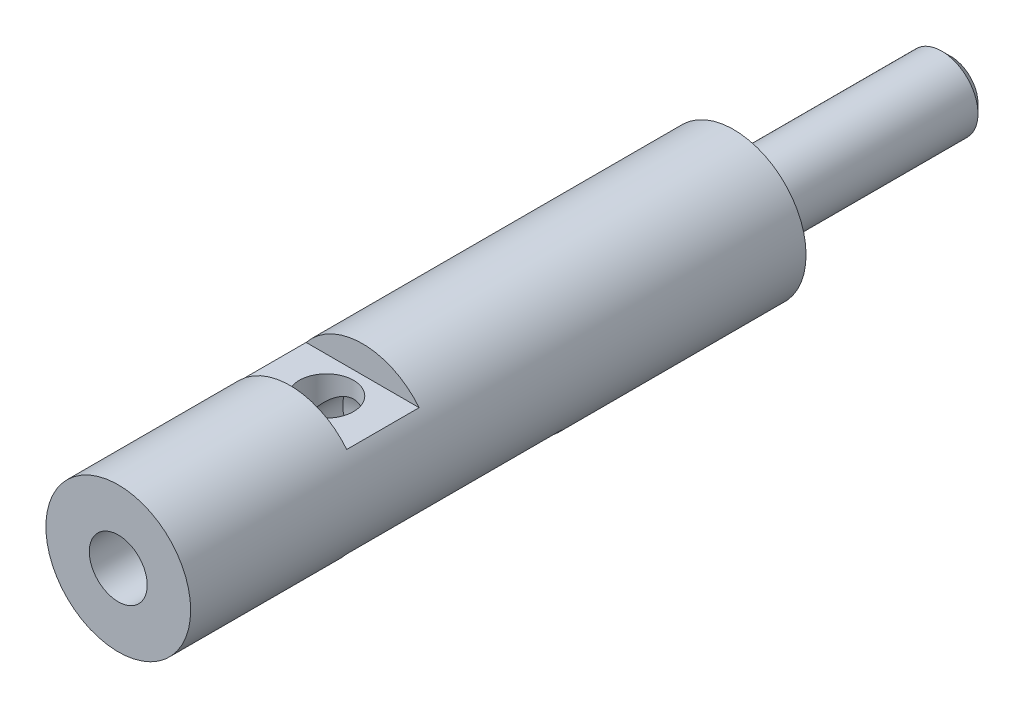
ISO-10303-21;
HEADER;
FILE_DESCRIPTION(('STEP AP214'),'2;1');
FILE_NAME('part.step','',(''),(''),'','','');
FILE_SCHEMA(('AUTOMOTIVE_DESIGN { 1 0 10303 214 1 1 1 1 }'));
ENDSEC;
DATA;
#1=APPLICATION_CONTEXT('core data for automotive mechanical design processes');
#2=APPLICATION_PROTOCOL_DEFINITION('international standard','automotive_design',2000,#1);
#3=PRODUCT_CONTEXT('',#1,'mechanical');
#4=PRODUCT('Part','Part','',(#3));
#5=PRODUCT_RELATED_PRODUCT_CATEGORY('part','',(#4));
#6=PRODUCT_DEFINITION_FORMATION('','',#4);
#7=PRODUCT_DEFINITION_CONTEXT('part definition',#1,'design');
#8=PRODUCT_DEFINITION('design','',#6,#7);
#9=PRODUCT_DEFINITION_SHAPE('','',#8);
#10=(LENGTH_UNIT() NAMED_UNIT(*) SI_UNIT(.MILLI.,.METRE.));
#11=(NAMED_UNIT(*) PLANE_ANGLE_UNIT() SI_UNIT($,.RADIAN.));
#12=(NAMED_UNIT(*) SI_UNIT($,.STERADIAN.) SOLID_ANGLE_UNIT());
#13=UNCERTAINTY_MEASURE_WITH_UNIT(LENGTH_MEASURE(1.E-05),#10,'distance_accuracy_value','');
#14=(GEOMETRIC_REPRESENTATION_CONTEXT(3) GLOBAL_UNCERTAINTY_ASSIGNED_CONTEXT((#13)) GLOBAL_UNIT_ASSIGNED_CONTEXT((#10,
#11,#12)) REPRESENTATION_CONTEXT('',''));
#15=CARTESIAN_POINT('',(0.,0.,0.));
#16=DIRECTION('',(0.,0.,1.));
#17=DIRECTION('',(1.,0.,0.));
#18=AXIS2_PLACEMENT_3D('',#15,#16,#17);
#19=CARTESIAN_POINT('',(0.,0.,-34.));
#20=DIRECTION('',(0.,0.,1.));
#21=DIRECTION('',(1.,0.,0.));
#22=AXIS2_PLACEMENT_3D('',#19,#20,#21);
#23=CYLINDRICAL_SURFACE('',#22,4.);
#24=CARTESIAN_POINT('',(0.,0.,-21.5));
#25=DIRECTION('',(0.,0.,-1.));
#26=DIRECTION('',(-1.,0.,0.));
#27=AXIS2_PLACEMENT_3D('',#24,#25,#26);
#28=CIRCLE('',#27,4.);
#29=CARTESIAN_POINT('',(-3.1224989991992,-2.5,-21.5));
#30=VERTEX_POINT('',#29);
#31=CARTESIAN_POINT('',(3.1224989991992,-2.5,-21.5));
#32=VERTEX_POINT('',#31);
#33=EDGE_CURVE('E99',#30,#32,#28,.F.);
#34=ORIENTED_EDGE('',*,*,#33,.F.);
#35=DIRECTION('',(0.,0.,1.));
#36=VECTOR('',#35,1.);
#37=CARTESIAN_POINT('',(-3.1224989991992,-2.5,-34.));
#38=LINE('',#37,#36);
#39=CARTESIAN_POINT('',(-3.1224989991992,-2.5,-9.5));
#40=VERTEX_POINT('',#39);
#41=EDGE_CURVE('E11',#40,#30,#38,.F.);
#42=ORIENTED_EDGE('',*,*,#41,.F.);
#43=CARTESIAN_POINT('',(0.,0.,-9.5));
#44=DIRECTION('',(0.,0.,1.));
#45=DIRECTION('',(0.,-1.,0.));
#46=AXIS2_PLACEMENT_3D('',#43,#44,#45);
#47=CIRCLE('',#46,4.);
#48=CARTESIAN_POINT('',(3.1224989991992,-2.5,-9.5));
#49=VERTEX_POINT('',#48);
#50=EDGE_CURVE('E51',#49,#40,#47,.F.);
#51=ORIENTED_EDGE('',*,*,#50,.F.);
#52=DIRECTION('',(0.,0.,1.));
#53=VECTOR('',#52,1.);
#54=CARTESIAN_POINT('',(3.1224989991992,-2.5,-34.));
#55=LINE('',#54,#53);
#56=EDGE_CURVE('E148',#32,#49,#55,.T.);
#57=ORIENTED_EDGE('',*,*,#56,.F.);
#58=EDGE_LOOP('',(#34,#42,#51,#57));
#59=FACE_BOUND('',#58,.T.);
#60=DIRECTION('',(0.,0.,1.));
#61=VECTOR('',#60,1.);
#62=CARTESIAN_POINT('',(3.1224989991992,2.5,-34.));
#63=LINE('',#62,#61);
#64=CARTESIAN_POINT('',(3.1224989991992,2.5,-9.5));
#65=VERTEX_POINT('',#64);
#66=CARTESIAN_POINT('',(3.1224989991992,2.5,-13.5));
#67=VERTEX_POINT('',#66);
#68=EDGE_CURVE('E88',#65,#67,#63,.F.);
#69=ORIENTED_EDGE('',*,*,#68,.F.);
#70=CARTESIAN_POINT('',(0.,0.,-9.50000000000001));
#71=DIRECTION('',(0.,0.,1.));
#72=DIRECTION('',(0.,-1.,0.));
#73=AXIS2_PLACEMENT_3D('',#70,#71,#72);
#74=CIRCLE('',#73,4.);
#75=CARTESIAN_POINT('',(-3.1224989991992,2.5,-9.5));
#76=VERTEX_POINT('',#75);
#77=EDGE_CURVE('E92',#76,#65,#74,.F.);
#78=ORIENTED_EDGE('',*,*,#77,.F.);
#79=DIRECTION('',(0.,0.,1.));
#80=VECTOR('',#79,1.);
#81=CARTESIAN_POINT('',(-3.1224989991992,2.5,-34.));
#82=LINE('',#81,#80);
#83=CARTESIAN_POINT('',(-3.1224989991992,2.5,-13.5));
#84=VERTEX_POINT('',#83);
#85=EDGE_CURVE('E89',#84,#76,#82,.T.);
#86=ORIENTED_EDGE('',*,*,#85,.F.);
#87=CARTESIAN_POINT('',(0.,0.,-13.5));
#88=DIRECTION('',(0.,0.,-1.));
#89=DIRECTION('',(-1.,0.,0.));
#90=AXIS2_PLACEMENT_3D('',#87,#88,#89);
#91=CIRCLE('',#90,4.);
#92=EDGE_CURVE('E85',#67,#84,#91,.F.);
#93=ORIENTED_EDGE('',*,*,#92,.F.);
#94=EDGE_LOOP('',(#69,#78,#86,#93));
#95=FACE_BOUND('',#94,.T.);
#96=CARTESIAN_POINT('',(0.,0.,-34.));
#97=DIRECTION('',(0.,0.,1.));
#98=DIRECTION('',(1.,0.,0.));
#99=AXIS2_PLACEMENT_3D('',#96,#97,#98);
#100=CIRCLE('',#99,4.);
#101=CARTESIAN_POINT('',(4.,0.,-34.));
#102=VERTEX_POINT('',#101);
#103=EDGE_CURVE('E128',#102,#102,#100,.T.);
#104=ORIENTED_EDGE('',*,*,#103,.T.);
#105=EDGE_LOOP('',(#104));
#106=FACE_BOUND('',#105,.T.);
#107=CARTESIAN_POINT('',(0.,0.,0.));
#108=DIRECTION('',(0.,0.,1.));
#109=DIRECTION('',(1.,0.,0.));
#110=AXIS2_PLACEMENT_3D('',#107,#108,#109);
#111=CIRCLE('',#110,4.);
#112=CARTESIAN_POINT('',(4.,0.,0.));
#113=VERTEX_POINT('',#112);
#114=EDGE_CURVE('E122',#113,#113,#111,.T.);
#115=ORIENTED_EDGE('',*,*,#114,.F.);
#116=EDGE_LOOP('',(#115));
#117=FACE_BOUND('',#116,.T.);
#118=ADVANCED_FACE('F41',(#59,#95,#106,#117),#23,.T.);
#119=CARTESIAN_POINT('',(0.,0.,-34.));
#120=DIRECTION('',(0.,0.,1.));
#121=DIRECTION('',(1.,0.,0.));
#122=AXIS2_PLACEMENT_3D('',#119,#120,#121);
#123=PLANE('',#122);
#124=CARTESIAN_POINT('',(0.,0.,-34.));
#125=DIRECTION('',(0.,0.,-1.));
#126=DIRECTION('',(-1.,0.,0.));
#127=AXIS2_PLACEMENT_3D('',#124,#125,#126);
#128=CIRCLE('',#127,2.);
#129=CARTESIAN_POINT('',(-2.,0.,-34.));
#130=VERTEX_POINT('',#129);
#131=EDGE_CURVE('E123',#130,#130,#128,.T.);
#132=ORIENTED_EDGE('',*,*,#131,.F.);
#133=EDGE_LOOP('',(#132));
#134=FACE_BOUND('',#133,.T.);
#135=ORIENTED_EDGE('',*,*,#103,.F.);
#136=EDGE_LOOP('',(#135));
#137=FACE_BOUND('',#136,.T.);
#138=ADVANCED_FACE('F177',(#134,#137),#123,.F.);
#139=CARTESIAN_POINT('',(0.,0.,0.));
#140=DIRECTION('',(0.,0.,1.));
#141=DIRECTION('',(1.,0.,0.));
#142=AXIS2_PLACEMENT_3D('',#139,#140,#141);
#143=PLANE('',#142);
#144=CARTESIAN_POINT('',(0.,0.,0.));
#145=DIRECTION('',(0.,0.,1.));
#146=DIRECTION('',(1.,0.,0.));
#147=AXIS2_PLACEMENT_3D('',#144,#145,#146);
#148=CIRCLE('',#147,1.59999999999999);
#149=CARTESIAN_POINT('',(1.59999999999999,0.,0.));
#150=VERTEX_POINT('',#149);
#151=EDGE_CURVE('E114',#150,#150,#148,.T.);
#152=ORIENTED_EDGE('',*,*,#151,.F.);
#153=EDGE_LOOP('',(#152));
#154=FACE_BOUND('',#153,.T.);
#155=ORIENTED_EDGE('',*,*,#114,.T.);
#156=EDGE_LOOP('',(#155));
#157=FACE_BOUND('',#156,.T.);
#158=ADVANCED_FACE('F181',(#154,#157),#143,.T.);
#159=CARTESIAN_POINT('',(0.,0.,-46.));
#160=DIRECTION('',(0.,0.,1.));
#161=DIRECTION('',(1.,0.,0.));
#162=AXIS2_PLACEMENT_3D('',#159,#160,#161);
#163=CYLINDRICAL_SURFACE('',#162,2.);
#164=CARTESIAN_POINT('',(0.,0.,-45.5));
#165=DIRECTION('',(0.,0.,-1.));
#166=DIRECTION('',(-1.,0.,0.));
#167=AXIS2_PLACEMENT_3D('',#164,#165,#166);
#168=CIRCLE('',#167,2.);
#169=CARTESIAN_POINT('',(-2.,0.,-45.5));
#170=VERTEX_POINT('',#169);
#171=EDGE_CURVE('E138',#170,#170,#168,.F.);
#172=ORIENTED_EDGE('',*,*,#171,.T.);
#173=EDGE_LOOP('',(#172));
#174=FACE_BOUND('',#173,.T.);
#175=ORIENTED_EDGE('',*,*,#131,.T.);
#176=EDGE_LOOP('',(#175));
#177=FACE_BOUND('',#176,.T.);
#178=ADVANCED_FACE('F186',(#174,#177),#163,.T.);
#179=CARTESIAN_POINT('',(0.,0.,-46.));
#180=DIRECTION('',(0.,0.,-1.));
#181=DIRECTION('',(-1.,0.,0.));
#182=AXIS2_PLACEMENT_3D('',#179,#180,#181);
#183=PLANE('',#182);
#184=CARTESIAN_POINT('',(0.,0.,-46.));
#185=DIRECTION('',(0.,0.,-1.));
#186=DIRECTION('',(-1.,0.,0.));
#187=AXIS2_PLACEMENT_3D('',#184,#185,#186);
#188=CIRCLE('',#187,1.5);
#189=CARTESIAN_POINT('',(-1.5,0.,-46.));
#190=VERTEX_POINT('',#189);
#191=EDGE_CURVE('E127',#190,#190,#188,.T.);
#192=ORIENTED_EDGE('',*,*,#191,.T.);
#193=EDGE_LOOP('',(#192));
#194=FACE_BOUND('',#193,.T.);
#195=ADVANCED_FACE('F191',(#194),#183,.T.);
#196=CARTESIAN_POINT('',(0.,0.,-46.));
#197=DIRECTION('',(0.,0.,1.));
#198=DIRECTION('',(1.,0.,0.));
#199=AXIS2_PLACEMENT_3D('',#196,#197,#198);
#200=CONICAL_SURFACE('',#199,1.5,0.78539816339744);
#201=ORIENTED_EDGE('',*,*,#171,.F.);
#202=EDGE_LOOP('',(#201));
#203=FACE_BOUND('',#202,.T.);
#204=ORIENTED_EDGE('',*,*,#191,.F.);
#205=EDGE_LOOP('',(#204));
#206=FACE_BOUND('',#205,.T.);
#207=ADVANCED_FACE('F44',(#203,#206),#200,.T.);
#208=CARTESIAN_POINT('',(0.,0.,-14.));
#209=DIRECTION('',(0.,0.,1.));
#210=DIRECTION('',(1.,0.,0.));
#211=AXIS2_PLACEMENT_3D('',#208,#209,#210);
#212=CONICAL_SURFACE('',#211,1.6,1.02974425867665);
#213=CARTESIAN_POINT('',(0.,0.,-14.9613769904441));
#214=VERTEX_POINT('',#213);
#215=VERTEX_LOOP('',#214);
#216=FACE_BOUND('',#215,.T.);
#217=CARTESIAN_POINT('',(0.,0.,-14.));
#218=DIRECTION('',(0.,0.,1.));
#219=DIRECTION('',(1.,0.,0.));
#220=AXIS2_PLACEMENT_3D('',#217,#218,#219);
#221=CIRCLE('',#220,1.6);
#222=CARTESIAN_POINT('',(1.6,0.,-14.));
#223=VERTEX_POINT('',#222);
#224=EDGE_CURVE('E118',#223,#223,#221,.T.);
#225=ORIENTED_EDGE('',*,*,#224,.T.);
#226=EDGE_LOOP('',(#225));
#227=FACE_BOUND('',#226,.T.);
#228=ADVANCED_FACE('F196',(#216,#227),#212,.F.);
#229=CARTESIAN_POINT('',(0.,0.,0.));
#230=DIRECTION('',(0.,0.,1.));
#231=DIRECTION('',(1.,0.,0.));
#232=AXIS2_PLACEMENT_3D('',#229,#230,#231);
#233=CYLINDRICAL_SURFACE('',#232,1.59999999999999);
#234=CARTESIAN_POINT('',(0.,1.59999999999999,-10.));
#235=CARTESIAN_POINT('',(0.0684255819523115,1.59999100993067,-10.0000090962978));
#236=CARTESIAN_POINT('',(0.136969761419658,1.59556467819543,-10.0047281971339));
#237=CARTESIAN_POINT('',(0.271820864103848,1.57821703920185,-10.0232539049869));
#238=CARTESIAN_POINT('',(0.338120531372211,1.56527051953187,-10.0370874831407));
#239=CARTESIAN_POINT('',(0.466029039157556,1.53204181361779,-10.0726973534836));
#240=CARTESIAN_POINT('',(0.52766798369946,1.51181264687308,-10.0944162480474));
#241=CARTESIAN_POINT('',(0.645624057326146,1.46533125031908,-10.1445358019232));
#242=CARTESIAN_POINT('',(0.701942648568487,1.43908068217026,-10.172934617905));
#243=CARTESIAN_POINT('',(0.830488511004103,1.37023549959972,-10.2478632281665));
#244=CARTESIAN_POINT('',(0.899909356040594,1.32532924968791,-10.2970760172881));
#245=CARTESIAN_POINT('',(1.02730053831725,1.22924745848653,-10.4038236725768));
#246=CARTESIAN_POINT('',(1.08523092595497,1.17805101301526,-10.4613864091608));
#247=CARTESIAN_POINT('',(1.17078105057247,1.09156202300322,-10.560920796247));
#248=CARTESIAN_POINT('',(1.20175833727903,1.05726375119173,-10.6009408086179));
#249=CARTESIAN_POINT('',(1.25930890566738,0.988010810145918,-10.6834986333498));
#250=CARTESIAN_POINT('',(1.28588281199331,0.953056234796473,-10.7260360874337));
#251=CARTESIAN_POINT('',(1.33467012957743,0.883435608136693,-10.8135864668672));
#252=CARTESIAN_POINT('',(1.35689236994422,0.848769112188214,-10.8585941376334));
#253=CARTESIAN_POINT('',(1.3970362278902,0.780917148192494,-10.9514994512178));
#254=CARTESIAN_POINT('',(1.4149635108398,0.747729776660347,-10.9993931815076));
#255=CARTESIAN_POINT('',(1.44158488802393,0.694574099514458,-11.0838822859475));
#256=CARTESIAN_POINT('',(1.45143080990949,0.673647073701061,-11.1195046105091));
#257=CARTESIAN_POINT('',(1.46874054388632,0.635016088570959,-11.1930368336448));
#258=CARTESIAN_POINT('',(1.47620697945578,0.617308588918452,-11.2309441576764));
#259=CARTESIAN_POINT('',(1.48710185280875,0.590503680558254,-11.3012201572755));
#260=CARTESIAN_POINT('',(1.49104694938892,0.580381760051782,-11.3331032235742));
#261=CARTESIAN_POINT('',(1.49689488628612,0.565132788162447,-11.3981894510155));
#262=CARTESIAN_POINT('',(1.49880415766172,0.559990012702321,-11.4313881095201));
#263=CARTESIAN_POINT('',(1.50037685312532,0.555766816396763,-11.4985170672047));
#264=CARTESIAN_POINT('',(1.50002232907756,0.556734843369686,-11.5324510822661));
#265=CARTESIAN_POINT('',(1.49707243273785,0.564613886898904,-11.5995451956431));
#266=CARTESIAN_POINT('',(1.4944718971692,0.571538596916512,-11.6327033297862));
#267=CARTESIAN_POINT('',(1.48583868780731,0.593691355415251,-11.7107065522608));
#268=CARTESIAN_POINT('',(1.47883660489909,0.611158481279119,-11.7547767608288));
#269=CARTESIAN_POINT('',(1.46163501869307,0.651230780563997,-11.8398884700143));
#270=CARTESIAN_POINT('',(1.45142140048049,0.673858512219679,-11.8809155928408));
#271=CARTESIAN_POINT('',(1.42705633043943,0.724130291338589,-11.964295134449));
#272=CARTESIAN_POINT('',(1.41262082836606,0.752047417768083,-12.0063961883063));
#273=CARTESIAN_POINT('',(1.38053670392534,0.809448984794798,-12.0882594625083));
#274=CARTESIAN_POINT('',(1.36288484352601,0.83893498346293,-12.1280192719695));
#275=CARTESIAN_POINT('',(1.3051305530831,0.928246532931986,-12.2444222286512));
#276=CARTESIAN_POINT('',(1.26024681474811,0.988886891758771,-12.3181312163075));
#277=CARTESIAN_POINT('',(1.15222226148889,1.11350800341083,-12.4651426434821));
#278=CARTESIAN_POINT('',(1.08770668085877,1.17721837960241,-12.5376707660719));
#279=CARTESIAN_POINT('',(0.941971511717629,1.29672721862757,-12.6714935311562));
#280=CARTESIAN_POINT('',(0.86081512421693,1.35255430540365,-12.7328290638758));
#281=CARTESIAN_POINT('',(0.715544871064887,1.43250376355303,-12.8199381988512));
#282=CARTESIAN_POINT('',(0.656464639142307,1.46066194156336,-12.8504193629851));
#283=CARTESIAN_POINT('',(0.532380202594964,1.51030557076396,-12.9039676752676));
#284=CARTESIAN_POINT('',(0.46737993591264,1.5317954163251,-12.9270397063194));
#285=CARTESIAN_POINT('',(0.332158679533447,1.56671039192709,-12.964454412966));
#286=CARTESIAN_POINT('',(0.261898429302663,1.58006627656505,-12.9787221497356));
#287=CARTESIAN_POINT('',(0.118916949535145,1.59719349756616,-12.9970096377307));
#288=CARTESIAN_POINT('',(0.0461977442778754,1.60097253214485,-13.0010376200462));
#289=CARTESIAN_POINT('',(-0.0898241742949429,1.5987422645432,-12.9986581904231));
#290=CARTESIAN_POINT('',(-0.153173912852345,1.59389115980747,-12.9934855518758));
#291=CARTESIAN_POINT('',(-0.277753685333689,1.57696068243675,-12.975403365772));
#292=CARTESIAN_POINT('',(-0.338983446812132,1.56488038437404,-12.9624928276668));
#293=CARTESIAN_POINT('',(-0.45773598641908,1.53435147837037,-12.9297793136347));
#294=CARTESIAN_POINT('',(-0.515265285072309,1.51591445776733,-12.9099888781736));
#295=CARTESIAN_POINT('',(-0.625826321394383,1.47371929048371,-12.8645218804443));
#296=CARTESIAN_POINT('',(-0.678856869780214,1.44995974275386,-12.8388437683204));
#297=CARTESIAN_POINT('',(-0.80432366625711,1.38569203947422,-12.7690194645366));
#298=CARTESIAN_POINT('',(-0.873816485374873,1.34262645456977,-12.7219326921356));
#299=CARTESIAN_POINT('',(-1.00176463057466,1.25009328041172,-12.6194762183997));
#300=CARTESIAN_POINT('',(-1.06018192297004,1.20060457993999,-12.5640791050474));
#301=CARTESIAN_POINT('',(-1.14747741148049,1.11605538641915,-12.4674270647179));
#302=CARTESIAN_POINT('',(-1.17951966582666,1.08204019580844,-12.4280484924892));
#303=CARTESIAN_POINT('',(-1.23917518469033,1.01317225735416,-12.3467515587635));
#304=CARTESIAN_POINT('',(-1.26678887424384,0.978319590257866,-12.3048334415346));
#305=CARTESIAN_POINT('',(-1.31764191463907,0.908666765165564,-12.218556692848));
#306=CARTESIAN_POINT('',(-1.34088972001461,0.873866637883975,-12.1742029978392));
#307=CARTESIAN_POINT('',(-1.38309994332714,0.80538329423353,-12.0827298984665));
#308=CARTESIAN_POINT('',(-1.40206704077597,0.771698892914984,-12.0356135858014));
#309=CARTESIAN_POINT('',(-1.43080243256964,0.7165738305701,-11.9518434003516));
#310=CARTESIAN_POINT('',(-1.44164985062665,0.69438798971743,-11.9160542008121));
#311=CARTESIAN_POINT('',(-1.46094173101545,0.652817311175947,-11.842208361234));
#312=CARTESIAN_POINT('',(-1.46938663186735,0.63343196264484,-11.8041521365202));
#313=CARTESIAN_POINT('',(-1.48226072963674,0.60260501756706,-11.7323453147986));
#314=CARTESIAN_POINT('',(-1.4871367841298,0.590364021627839,-11.6990307214481));
#315=CARTESIAN_POINT('',(-1.49468197065955,0.570995915270087,-11.6307524923585));
#316=CARTESIAN_POINT('',(-1.49735937115688,0.563849658605715,-11.5957955624772));
#317=CARTESIAN_POINT('',(-1.50022554535816,0.556188195946329,-11.5245568122864));
#318=CARTESIAN_POINT('',(-1.50038283453941,0.555756883688063,-11.488263900227));
#319=CARTESIAN_POINT('',(-1.4980998148631,0.561875339118333,-11.4163325816119));
#320=CARTESIAN_POINT('',(-1.49565398700772,0.568439939227098,-11.380695729265));
#321=CARTESIAN_POINT('',(-1.48749788637684,0.589493082818552,-11.3016563649174));
#322=CARTESIAN_POINT('',(-1.48107662983667,0.605660277513027,-11.2588024446772));
#323=CARTESIAN_POINT('',(-1.46519284514556,0.643137620116827,-11.175957538847));
#324=CARTESIAN_POINT('',(-1.45571686428683,0.664470411421138,-11.1359801921781));
#325=CARTESIAN_POINT('',(-1.43308878736763,0.712049693883306,-11.0548129753519));
#326=CARTESIAN_POINT('',(-1.41967554469702,0.738569250729476,-11.0138601198266));
#327=CARTESIAN_POINT('',(-1.38985030146091,0.793280785771154,-10.9342061780958));
#328=CARTESIAN_POINT('',(-1.37343521142805,0.821474466580529,-10.8955074664367));
#329=CARTESIAN_POINT('',(-1.31974256303737,0.907082200617736,-10.7821589547871));
#330=CARTESIAN_POINT('',(-1.27803283329951,0.965488439995814,-10.7103094131892));
#331=CARTESIAN_POINT('',(-1.17693332909144,1.08712656870905,-10.5653838564812));
#332=CARTESIAN_POINT('',(-1.11604484000422,1.15012229053256,-10.4931500874728));
#333=CARTESIAN_POINT('',(-0.978384321159554,1.26925092061589,-10.3589749614361));
#334=CARTESIAN_POINT('',(-0.90166344005342,1.32540502482404,-10.2970015909359));
#335=CARTESIAN_POINT('',(-0.761516551758962,1.40863661354699,-10.2059900545818));
#336=CARTESIAN_POINT('',(-0.702656139422138,1.43905674895607,-10.1729707472108));
#337=CARTESIAN_POINT('',(-0.578477152845037,1.49329683004648,-10.1143373223451));
#338=CARTESIAN_POINT('',(-0.51316297425837,1.51712122660306,-10.0887182106105));
#339=CARTESIAN_POINT('',(-0.38620040814022,1.55390938239855,-10.0492492504271));
#340=CARTESIAN_POINT('',(-0.325189090831698,1.56788580592606,-10.0342986233955));
#341=CARTESIAN_POINT('',(-0.200670425393355,1.58861097203542,-10.0121489553886));
#342=CARTESIAN_POINT('',(-0.137170487817838,1.59537969972829,-10.0049284803625));
#343=CARTESIAN_POINT('',(-0.0489577110307338,1.59944074803712,-10.0005966544392));
#344=CARTESIAN_POINT('',(-0.0244864493340558,1.60000321714292,-9.99999674484266));
#345=CARTESIAN_POINT('',(0.,1.59999999999999,-10.));
#346=B_SPLINE_CURVE_WITH_KNOTS('',3,(#234,#235,#236,#237,#238,#239,#240,#241,#242,#243,#244,
#245,#246,#247,#248,#249,#250,#251,#252,#253,#254,#255,#256,#257,#258,#259,#260,#261,#262,#263,
#264,#265,#266,#267,#268,#269,#270,#271,#272,#273,#274,#275,#276,#277,#278,#279,#280,#281,#282,
#283,#284,#285,#286,#287,#288,#289,#290,#291,#292,#293,#294,#295,#296,#297,#298,#299,#300,#301,
#302,#303,#304,#305,#306,#307,#308,#309,#310,#311,#312,#313,#314,#315,#316,#317,#318,#319,#320,
#321,#322,#323,#324,#325,#326,#327,#328,#329,#330,#331,#332,#333,#334,#335,#336,#337,#338,#339,
#340,#341,#342,#343,#344,#345),.UNSPECIFIED.,.T.,.F.,(4,2,2,2,2,2,2,2,2,2,2,2,2,2,2,2,2,2,2,2,2,
2,2,2,2,2,2,2,2,2,2,2,2,2,2,2,2,2,2,2,2,2,2,2,2,2,2,2,2,2,2,2,2,2,2,4),(0.,0.205191194350401,
0.410992324539083,0.615324504475545,0.819600364781851,1.10668891633045,1.39475875441688,
1.57797159708169,1.76115842768929,1.94396964900547,2.1265383843133,2.25379522043879,
2.38091126151401,2.48161669197438,2.58200304846303,2.68318628478435,2.78460274869497,
2.92755182236974,3.07113816175826,3.22851946560474,3.38606009559672,3.70135424338246,
4.04810638258296,4.39356518751198,4.60938269160769,4.8250576703877,5.0425439470359,
5.2598553448823,5.4501575115817,5.64048404456583,5.83046545960808,6.02049694236049,
6.30198386380246,6.58442057318485,6.76754781754566,6.95065747555075,7.13340880043481,
7.31595937010022,7.44626722225468,7.57655127464998,7.68369231421017,7.79042855986852,
7.89849726875139,8.00679555674797,8.14477595318693,8.28337249894482,8.4349475782737,
8.5866795440114,8.89033594061586,9.2295628738984,9.56771058052487,9.78902158846351,
10.0101828873085,10.2024308125783,10.3941442839537,10.4675730169056),.UNSPECIFIED.);
#347=CARTESIAN_POINT('',(0.,1.59999999999999,-10.));
#348=VERTEX_POINT('',#347);
#349=EDGE_CURVE('E110',#348,#348,#346,.T.);
#350=ORIENTED_EDGE('',*,*,#349,.T.);
#351=EDGE_LOOP('',(#350));
#352=FACE_BOUND('',#351,.T.);
#353=ORIENTED_EDGE('',*,*,#224,.F.);
#354=EDGE_LOOP('',(#353));
#355=FACE_BOUND('',#354,.T.);
#356=ORIENTED_EDGE('',*,*,#151,.T.);
#357=EDGE_LOOP('',(#356));
#358=FACE_BOUND('',#357,.T.);
#359=ADVANCED_FACE('F199',(#352,#355,#358),#233,.F.);
#360=CARTESIAN_POINT('',(-4.,4.,-9.5));
#361=DIRECTION('',(0.,0.,1.));
#362=DIRECTION('',(0.,-1.,0.));
#363=AXIS2_PLACEMENT_3D('',#360,#361,#362);
#364=PLANE('',#363);
#365=ORIENTED_EDGE('',*,*,#77,.T.);
#366=DIRECTION('',(1.,0.,0.));
#367=VECTOR('',#366,1.);
#368=CARTESIAN_POINT('',(-4.,2.5,-9.5));
#369=LINE('',#368,#367);
#370=EDGE_CURVE('E97',#76,#65,#369,.T.);
#371=ORIENTED_EDGE('',*,*,#370,.F.);
#372=EDGE_LOOP('',(#365,#371));
#373=FACE_BOUND('',#372,.T.);
#374=ADVANCED_FACE('F202',(#373),#364,.F.);
#375=CARTESIAN_POINT('',(-4.,4.,-13.5));
#376=DIRECTION('',(0.,0.,-1.));
#377=DIRECTION('',(-1.,0.,0.));
#378=AXIS2_PLACEMENT_3D('',#375,#376,#377);
#379=PLANE('',#378);
#380=DIRECTION('',(1.,0.,0.));
#381=VECTOR('',#380,1.);
#382=CARTESIAN_POINT('',(-4.,2.5,-13.5));
#383=LINE('',#382,#381);
#384=EDGE_CURVE('E58',#84,#67,#383,.T.);
#385=ORIENTED_EDGE('',*,*,#384,.T.);
#386=ORIENTED_EDGE('',*,*,#92,.T.);
#387=EDGE_LOOP('',(#385,#386));
#388=FACE_BOUND('',#387,.T.);
#389=ADVANCED_FACE('F101',(#388),#379,.F.);
#390=CARTESIAN_POINT('',(-4.,2.5,-9.5));
#391=DIRECTION('',(0.,-1.,0.));
#392=DIRECTION('',(0.,0.,-1.));
#393=AXIS2_PLACEMENT_3D('',#390,#391,#392);
#394=PLANE('',#393);
#395=CARTESIAN_POINT('',(0.,2.5,-11.5));
#396=DIRECTION('',(0.,1.,0.));
#397=DIRECTION('',(0.,0.,1.));
#398=AXIS2_PLACEMENT_3D('',#395,#396,#397);
#399=CIRCLE('',#398,1.49999999999999);
#400=CARTESIAN_POINT('',(0.,2.5,-10.));
#401=VERTEX_POINT('',#400);
#402=EDGE_CURVE('E312',#401,#401,#399,.T.);
#403=ORIENTED_EDGE('',*,*,#402,.F.);
#404=EDGE_LOOP('',(#403));
#405=FACE_BOUND('',#404,.T.);
#406=ORIENTED_EDGE('',*,*,#68,.T.);
#407=ORIENTED_EDGE('',*,*,#384,.F.);
#408=ORIENTED_EDGE('',*,*,#85,.T.);
#409=ORIENTED_EDGE('',*,*,#370,.T.);
#410=EDGE_LOOP('',(#406,#407,#408,#409));
#411=FACE_BOUND('',#410,.T.);
#412=ADVANCED_FACE('F95',(#405,#411),#394,.F.);
#413=CARTESIAN_POINT('',(-4.,-4.,-9.5));
#414=DIRECTION('',(0.,0.,1.));
#415=DIRECTION('',(0.,-1.,0.));
#416=AXIS2_PLACEMENT_3D('',#413,#414,#415);
#417=PLANE('',#416);
#418=ORIENTED_EDGE('',*,*,#50,.T.);
#419=DIRECTION('',(1.,0.,0.));
#420=VECTOR('',#419,1.);
#421=CARTESIAN_POINT('',(-4.,-2.5,-9.5));
#422=LINE('',#421,#420);
#423=EDGE_CURVE('E108',#40,#49,#422,.T.);
#424=ORIENTED_EDGE('',*,*,#423,.T.);
#425=EDGE_LOOP('',(#418,#424));
#426=FACE_BOUND('',#425,.T.);
#427=ADVANCED_FACE('F155',(#426),#417,.F.);
#428=CARTESIAN_POINT('',(-4.,-2.5,-9.5));
#429=DIRECTION('',(0.,1.,0.));
#430=DIRECTION('',(0.,0.,1.));
#431=AXIS2_PLACEMENT_3D('',#428,#429,#430);
#432=PLANE('',#431);
#433=ORIENTED_EDGE('',*,*,#41,.T.);
#434=DIRECTION('',(1.,0.,0.));
#435=VECTOR('',#434,1.);
#436=CARTESIAN_POINT('',(-4.,-2.5,-21.5));
#437=LINE('',#436,#435);
#438=EDGE_CURVE('E103',#30,#32,#437,.T.);
#439=ORIENTED_EDGE('',*,*,#438,.T.);
#440=ORIENTED_EDGE('',*,*,#56,.T.);
#441=ORIENTED_EDGE('',*,*,#423,.F.);
#442=EDGE_LOOP('',(#433,#439,#440,#441));
#443=FACE_BOUND('',#442,.T.);
#444=ADVANCED_FACE('F160',(#443),#432,.F.);
#445=CARTESIAN_POINT('',(-4.,-4.,-21.5));
#446=DIRECTION('',(0.,0.,-1.));
#447=DIRECTION('',(-1.,0.,0.));
#448=AXIS2_PLACEMENT_3D('',#445,#446,#447);
#449=PLANE('',#448);
#450=ORIENTED_EDGE('',*,*,#438,.F.);
#451=ORIENTED_EDGE('',*,*,#33,.T.);
#452=EDGE_LOOP('',(#450,#451));
#453=FACE_BOUND('',#452,.T.);
#454=ADVANCED_FACE('F164',(#453),#449,.F.);
#455=CARTESIAN_POINT('',(0.,2.5,-11.5));
#456=DIRECTION('',(0.,1.,0.));
#457=DIRECTION('',(0.,0.,1.));
#458=AXIS2_PLACEMENT_3D('',#455,#456,#457);
#459=CYLINDRICAL_SURFACE('',#458,1.49999999999999);
#460=ORIENTED_EDGE('',*,*,#349,.F.);
#461=EDGE_LOOP('',(#460));
#462=FACE_BOUND('',#461,.T.);
#463=ORIENTED_EDGE('',*,*,#402,.T.);
#464=EDGE_LOOP('',(#463));
#465=FACE_BOUND('',#464,.T.);
#466=ADVANCED_FACE('F166',(#462,#465),#459,.F.);
#467=CLOSED_SHELL('',(#118,#138,#158,#178,#195,#207,#228,#359,#374,#389,#412,#427,#444,#454,#466));
#468=MANIFOLD_SOLID_BREP('B2',#467);
#469=ADVANCED_BREP_SHAPE_REPRESENTATION('',(#18,#468),#14);
#470=SHAPE_DEFINITION_REPRESENTATION(#9,#469);
ENDSEC;
END-ISO-10303-21;
